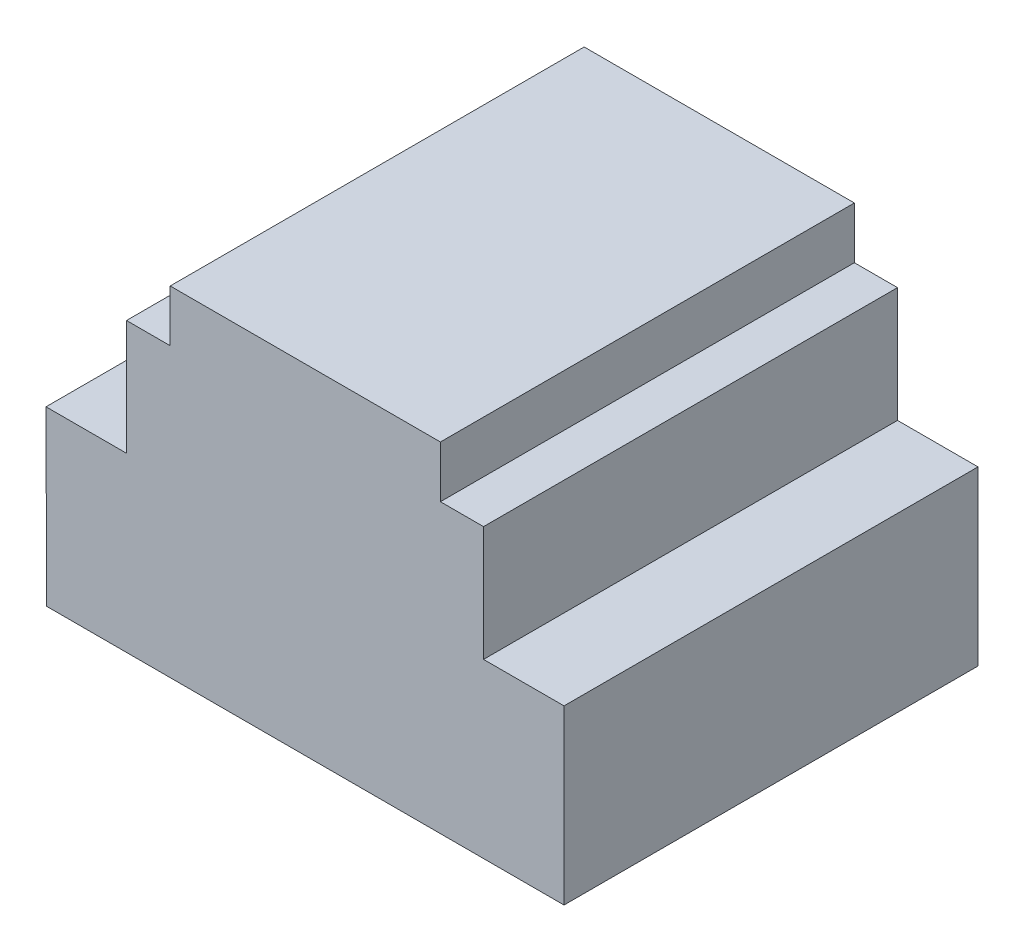
ISO-10303-21;
HEADER;
FILE_DESCRIPTION(('STEP AP214'),'2;1');
FILE_NAME('part.step','',(''),(''),'','','');
FILE_SCHEMA(('AUTOMOTIVE_DESIGN { 1 0 10303 214 1 1 1 1 }'));
ENDSEC;
DATA;
#1=APPLICATION_CONTEXT('core data for automotive mechanical design processes');
#2=APPLICATION_PROTOCOL_DEFINITION('international standard','automotive_design',2000,#1);
#3=PRODUCT_CONTEXT('',#1,'mechanical');
#4=PRODUCT('Part','Part','',(#3));
#5=PRODUCT_RELATED_PRODUCT_CATEGORY('part','',(#4));
#6=PRODUCT_DEFINITION_FORMATION('','',#4);
#7=PRODUCT_DEFINITION_CONTEXT('part definition',#1,'design');
#8=PRODUCT_DEFINITION('design','',#6,#7);
#9=PRODUCT_DEFINITION_SHAPE('','',#8);
#10=(LENGTH_UNIT() NAMED_UNIT(*) SI_UNIT(.MILLI.,.METRE.));
#11=(NAMED_UNIT(*) PLANE_ANGLE_UNIT() SI_UNIT($,.RADIAN.));
#12=(NAMED_UNIT(*) SI_UNIT($,.STERADIAN.) SOLID_ANGLE_UNIT());
#13=UNCERTAINTY_MEASURE_WITH_UNIT(LENGTH_MEASURE(1.E-05),#10,'distance_accuracy_value','');
#14=(GEOMETRIC_REPRESENTATION_CONTEXT(3) GLOBAL_UNCERTAINTY_ASSIGNED_CONTEXT((#13)) GLOBAL_UNIT_ASSIGNED_CONTEXT((#10,
#11,#12)) REPRESENTATION_CONTEXT('',''));
#15=CARTESIAN_POINT('',(0.,0.,0.));
#16=DIRECTION('',(0.,0.,1.));
#17=DIRECTION('',(1.,0.,0.));
#18=AXIS2_PLACEMENT_3D('',#15,#16,#17);
#19=CARTESIAN_POINT('',(-0.0999999999999908,30.,72.));
#20=DIRECTION('',(0.99999444449074,0.00333331481496883,0.));
#21=DIRECTION('',(-0.00333331481496883,0.99999444449074,0.));
#22=AXIS2_PLACEMENT_3D('',#19,#20,#21);
#23=PLANE('',#22);
#24=DIRECTION('',(0.00333331481496883,-0.99999444449074,0.));
#25=VECTOR('',#24,1.);
#26=CARTESIAN_POINT('',(-0.0999999999999908,30.,0.));
#27=LINE('',#26,#25);
#28=CARTESIAN_POINT('',(-0.0999999999999908,30.,0.));
#29=VERTEX_POINT('',#28);
#30=CARTESIAN_POINT('',(0.,0.,0.));
#31=VERTEX_POINT('',#30);
#32=EDGE_CURVE('E156',#29,#31,#27,.T.);
#33=ORIENTED_EDGE('',*,*,#32,.T.);
#34=DIRECTION('',(0.,0.,-1.));
#35=VECTOR('',#34,1.);
#36=CARTESIAN_POINT('',(0.,0.,72.));
#37=LINE('',#36,#35);
#38=CARTESIAN_POINT('',(0.,0.,72.));
#39=VERTEX_POINT('',#38);
#40=EDGE_CURVE('E11',#39,#31,#37,.T.);
#41=ORIENTED_EDGE('',*,*,#40,.F.);
#42=DIRECTION('',(0.00333331481496883,-0.99999444449074,0.));
#43=VECTOR('',#42,1.);
#44=CARTESIAN_POINT('',(-0.0999999999999908,30.,72.));
#45=LINE('',#44,#43);
#46=CARTESIAN_POINT('',(-0.0999999999999908,30.,72.));
#47=VERTEX_POINT('',#46);
#48=EDGE_CURVE('E178',#47,#39,#45,.T.);
#49=ORIENTED_EDGE('',*,*,#48,.F.);
#50=DIRECTION('',(0.,0.,-1.));
#51=VECTOR('',#50,1.);
#52=CARTESIAN_POINT('',(-0.0999999999999908,30.,72.));
#53=LINE('',#52,#51);
#54=EDGE_CURVE('E152',#47,#29,#53,.T.);
#55=ORIENTED_EDGE('',*,*,#54,.T.);
#56=EDGE_LOOP('',(#33,#41,#49,#55));
#57=FACE_BOUND('',#56,.T.);
#58=ADVANCED_FACE('F36',(#57),#23,.F.);
#59=CARTESIAN_POINT('',(0.,0.,72.));
#60=DIRECTION('',(0.,1.,0.));
#61=DIRECTION('',(0.,0.,1.));
#62=AXIS2_PLACEMENT_3D('',#59,#60,#61);
#63=PLANE('',#62);
#64=DIRECTION('',(1.,0.,0.));
#65=VECTOR('',#64,1.);
#66=CARTESIAN_POINT('',(0.,0.,0.));
#67=LINE('',#66,#65);
#68=CARTESIAN_POINT('',(90.,0.,0.));
#69=VERTEX_POINT('',#68);
#70=EDGE_CURVE('E159',#31,#69,#67,.T.);
#71=ORIENTED_EDGE('',*,*,#70,.T.);
#72=DIRECTION('',(0.,0.,-1.));
#73=VECTOR('',#72,1.);
#74=CARTESIAN_POINT('',(90.,0.,72.));
#75=LINE('',#74,#73);
#76=CARTESIAN_POINT('',(90.,0.,72.));
#77=VERTEX_POINT('',#76);
#78=EDGE_CURVE('E44',#77,#69,#75,.T.);
#79=ORIENTED_EDGE('',*,*,#78,.F.);
#80=DIRECTION('',(1.,0.,0.));
#81=VECTOR('',#80,1.);
#82=CARTESIAN_POINT('',(0.,0.,72.));
#83=LINE('',#82,#81);
#84=EDGE_CURVE('E107',#39,#77,#83,.T.);
#85=ORIENTED_EDGE('',*,*,#84,.F.);
#86=ORIENTED_EDGE('',*,*,#40,.T.);
#87=EDGE_LOOP('',(#71,#79,#85,#86));
#88=FACE_BOUND('',#87,.T.);
#89=ADVANCED_FACE('F256',(#88),#63,.F.);
#90=CARTESIAN_POINT('',(90.,0.,72.));
#91=DIRECTION('',(-1.,0.,0.));
#92=DIRECTION('',(0.,0.,1.));
#93=AXIS2_PLACEMENT_3D('',#90,#91,#92);
#94=PLANE('',#93);
#95=DIRECTION('',(0.,1.,0.));
#96=VECTOR('',#95,1.);
#97=CARTESIAN_POINT('',(90.,0.,0.));
#98=LINE('',#97,#96);
#99=CARTESIAN_POINT('',(90.,30.,0.));
#100=VERTEX_POINT('',#99);
#101=EDGE_CURVE('E161',#69,#100,#98,.T.);
#102=ORIENTED_EDGE('',*,*,#101,.T.);
#103=DIRECTION('',(0.,0.,-1.));
#104=VECTOR('',#103,1.);
#105=CARTESIAN_POINT('',(90.,30.,72.));
#106=LINE('',#105,#104);
#107=CARTESIAN_POINT('',(90.,30.,72.));
#108=VERTEX_POINT('',#107);
#109=EDGE_CURVE('E197',#108,#100,#106,.T.);
#110=ORIENTED_EDGE('',*,*,#109,.F.);
#111=DIRECTION('',(0.,1.,0.));
#112=VECTOR('',#111,1.);
#113=CARTESIAN_POINT('',(90.,0.,72.));
#114=LINE('',#113,#112);
#115=EDGE_CURVE('E205',#77,#108,#114,.T.);
#116=ORIENTED_EDGE('',*,*,#115,.F.);
#117=ORIENTED_EDGE('',*,*,#78,.T.);
#118=EDGE_LOOP('',(#102,#110,#116,#117));
#119=FACE_BOUND('',#118,.T.);
#120=ADVANCED_FACE('F203',(#119),#94,.F.);
#121=CARTESIAN_POINT('',(90.,30.,72.));
#122=DIRECTION('',(0.,-1.,0.));
#123=DIRECTION('',(0.,0.,-1.));
#124=AXIS2_PLACEMENT_3D('',#121,#122,#123);
#125=PLANE('',#124);
#126=DIRECTION('',(-1.,0.,0.));
#127=VECTOR('',#126,1.);
#128=CARTESIAN_POINT('',(90.,30.,0.));
#129=LINE('',#128,#127);
#130=CARTESIAN_POINT('',(76.,30.,0.));
#131=VERTEX_POINT('',#130);
#132=EDGE_CURVE('E163',#100,#131,#129,.T.);
#133=ORIENTED_EDGE('',*,*,#132,.T.);
#134=DIRECTION('',(0.,0.,-1.));
#135=VECTOR('',#134,1.);
#136=CARTESIAN_POINT('',(76.,30.,72.));
#137=LINE('',#136,#135);
#138=CARTESIAN_POINT('',(76.,30.,72.));
#139=VERTEX_POINT('',#138);
#140=EDGE_CURVE('E194',#139,#131,#137,.T.);
#141=ORIENTED_EDGE('',*,*,#140,.F.);
#142=DIRECTION('',(-1.,0.,0.));
#143=VECTOR('',#142,1.);
#144=CARTESIAN_POINT('',(90.,30.,72.));
#145=LINE('',#144,#143);
#146=EDGE_CURVE('E223',#108,#139,#145,.T.);
#147=ORIENTED_EDGE('',*,*,#146,.F.);
#148=ORIENTED_EDGE('',*,*,#109,.T.);
#149=EDGE_LOOP('',(#133,#141,#147,#148));
#150=FACE_BOUND('',#149,.T.);
#151=ADVANCED_FACE('F214',(#150),#125,.F.);
#152=CARTESIAN_POINT('',(76.,30.,72.));
#153=DIRECTION('',(-1.,0.,0.));
#154=DIRECTION('',(0.,0.,1.));
#155=AXIS2_PLACEMENT_3D('',#152,#153,#154);
#156=PLANE('',#155);
#157=DIRECTION('',(0.,1.,0.));
#158=VECTOR('',#157,1.);
#159=CARTESIAN_POINT('',(76.,30.,0.));
#160=LINE('',#159,#158);
#161=CARTESIAN_POINT('',(76.,50.,0.));
#162=VERTEX_POINT('',#161);
#163=EDGE_CURVE('E165',#131,#162,#160,.T.);
#164=ORIENTED_EDGE('',*,*,#163,.T.);
#165=DIRECTION('',(0.,0.,-1.));
#166=VECTOR('',#165,1.);
#167=CARTESIAN_POINT('',(76.,50.,72.));
#168=LINE('',#167,#166);
#169=CARTESIAN_POINT('',(76.,50.,72.));
#170=VERTEX_POINT('',#169);
#171=EDGE_CURVE('E191',#170,#162,#168,.T.);
#172=ORIENTED_EDGE('',*,*,#171,.F.);
#173=DIRECTION('',(0.,1.,0.));
#174=VECTOR('',#173,1.);
#175=CARTESIAN_POINT('',(76.,30.,72.));
#176=LINE('',#175,#174);
#177=EDGE_CURVE('E220',#139,#170,#176,.T.);
#178=ORIENTED_EDGE('',*,*,#177,.F.);
#179=ORIENTED_EDGE('',*,*,#140,.T.);
#180=EDGE_LOOP('',(#164,#172,#178,#179));
#181=FACE_BOUND('',#180,.T.);
#182=ADVANCED_FACE('F218',(#181),#156,.F.);
#183=CARTESIAN_POINT('',(76.,50.,72.));
#184=DIRECTION('',(0.,-1.,0.));
#185=DIRECTION('',(0.,0.,-1.));
#186=AXIS2_PLACEMENT_3D('',#183,#184,#185);
#187=PLANE('',#186);
#188=DIRECTION('',(-1.,0.,0.));
#189=VECTOR('',#188,1.);
#190=CARTESIAN_POINT('',(76.,50.,0.));
#191=LINE('',#190,#189);
#192=CARTESIAN_POINT('',(68.5,50.,0.));
#193=VERTEX_POINT('',#192);
#194=EDGE_CURVE('E167',#162,#193,#191,.T.);
#195=ORIENTED_EDGE('',*,*,#194,.T.);
#196=DIRECTION('',(0.,0.,-1.));
#197=VECTOR('',#196,1.);
#198=CARTESIAN_POINT('',(68.5,50.,72.));
#199=LINE('',#198,#197);
#200=CARTESIAN_POINT('',(68.5,50.,72.));
#201=VERTEX_POINT('',#200);
#202=EDGE_CURVE('E188',#201,#193,#199,.T.);
#203=ORIENTED_EDGE('',*,*,#202,.F.);
#204=DIRECTION('',(-1.,0.,0.));
#205=VECTOR('',#204,1.);
#206=CARTESIAN_POINT('',(76.,50.,72.));
#207=LINE('',#206,#205);
#208=EDGE_CURVE('E222',#170,#201,#207,.T.);
#209=ORIENTED_EDGE('',*,*,#208,.F.);
#210=ORIENTED_EDGE('',*,*,#171,.T.);
#211=EDGE_LOOP('',(#195,#203,#209,#210));
#212=FACE_BOUND('',#211,.T.);
#213=ADVANCED_FACE('F269',(#212),#187,.F.);
#214=CARTESIAN_POINT('',(68.5,50.,72.));
#215=DIRECTION('',(-1.,0.,0.));
#216=DIRECTION('',(0.,0.,1.));
#217=AXIS2_PLACEMENT_3D('',#214,#215,#216);
#218=PLANE('',#217);
#219=DIRECTION('',(0.,1.,0.));
#220=VECTOR('',#219,1.);
#221=CARTESIAN_POINT('',(68.5,50.,0.));
#222=LINE('',#221,#220);
#223=CARTESIAN_POINT('',(68.5,59.,0.));
#224=VERTEX_POINT('',#223);
#225=EDGE_CURVE('E169',#193,#224,#222,.T.);
#226=ORIENTED_EDGE('',*,*,#225,.T.);
#227=DIRECTION('',(0.,0.,-1.));
#228=VECTOR('',#227,1.);
#229=CARTESIAN_POINT('',(68.5,59.,72.));
#230=LINE('',#229,#228);
#231=CARTESIAN_POINT('',(68.5,59.,72.));
#232=VERTEX_POINT('',#231);
#233=EDGE_CURVE('E185',#232,#224,#230,.T.);
#234=ORIENTED_EDGE('',*,*,#233,.F.);
#235=DIRECTION('',(0.,1.,0.));
#236=VECTOR('',#235,1.);
#237=CARTESIAN_POINT('',(68.5,50.,72.));
#238=LINE('',#237,#236);
#239=EDGE_CURVE('E225',#201,#232,#238,.T.);
#240=ORIENTED_EDGE('',*,*,#239,.F.);
#241=ORIENTED_EDGE('',*,*,#202,.T.);
#242=EDGE_LOOP('',(#226,#234,#240,#241));
#243=FACE_BOUND('',#242,.T.);
#244=ADVANCED_FACE('F272',(#243),#218,.F.);
#245=CARTESIAN_POINT('',(68.5,59.,72.));
#246=DIRECTION('',(0.,-1.,0.));
#247=DIRECTION('',(1.,0.,0.));
#248=AXIS2_PLACEMENT_3D('',#245,#246,#247);
#249=PLANE('',#248);
#250=DIRECTION('',(-1.,0.,0.));
#251=VECTOR('',#250,1.);
#252=CARTESIAN_POINT('',(68.5,59.,0.));
#253=LINE('',#252,#251);
#254=CARTESIAN_POINT('',(21.5,59.,0.));
#255=VERTEX_POINT('',#254);
#256=EDGE_CURVE('E171',#224,#255,#253,.T.);
#257=ORIENTED_EDGE('',*,*,#256,.T.);
#258=DIRECTION('',(0.,0.,-1.));
#259=VECTOR('',#258,1.);
#260=CARTESIAN_POINT('',(21.5,59.,72.));
#261=LINE('',#260,#259);
#262=CARTESIAN_POINT('',(21.5,59.,72.));
#263=VERTEX_POINT('',#262);
#264=EDGE_CURVE('E182',#263,#255,#261,.T.);
#265=ORIENTED_EDGE('',*,*,#264,.F.);
#266=DIRECTION('',(-1.,0.,0.));
#267=VECTOR('',#266,1.);
#268=CARTESIAN_POINT('',(68.5,59.,72.));
#269=LINE('',#268,#267);
#270=EDGE_CURVE('E231',#232,#263,#269,.T.);
#271=ORIENTED_EDGE('',*,*,#270,.F.);
#272=ORIENTED_EDGE('',*,*,#233,.T.);
#273=EDGE_LOOP('',(#257,#265,#271,#272));
#274=FACE_BOUND('',#273,.T.);
#275=ADVANCED_FACE('F237',(#274),#249,.F.);
#276=CARTESIAN_POINT('',(21.5,59.,72.));
#277=DIRECTION('',(1.,0.,0.));
#278=DIRECTION('',(0.,0.,-1.));
#279=AXIS2_PLACEMENT_3D('',#276,#277,#278);
#280=PLANE('',#279);
#281=DIRECTION('',(0.,-1.,0.));
#282=VECTOR('',#281,1.);
#283=CARTESIAN_POINT('',(21.5,59.,0.));
#284=LINE('',#283,#282);
#285=CARTESIAN_POINT('',(21.5,50.,0.));
#286=VERTEX_POINT('',#285);
#287=EDGE_CURVE('E173',#255,#286,#284,.T.);
#288=ORIENTED_EDGE('',*,*,#287,.T.);
#289=DIRECTION('',(0.,0.,-1.));
#290=VECTOR('',#289,1.);
#291=CARTESIAN_POINT('',(21.5,50.,72.));
#292=LINE('',#291,#290);
#293=CARTESIAN_POINT('',(21.5,50.,72.));
#294=VERTEX_POINT('',#293);
#295=EDGE_CURVE('E147',#294,#286,#292,.T.);
#296=ORIENTED_EDGE('',*,*,#295,.F.);
#297=DIRECTION('',(0.,-1.,0.));
#298=VECTOR('',#297,1.);
#299=CARTESIAN_POINT('',(21.5,59.,72.));
#300=LINE('',#299,#298);
#301=EDGE_CURVE('E138',#263,#294,#300,.T.);
#302=ORIENTED_EDGE('',*,*,#301,.F.);
#303=ORIENTED_EDGE('',*,*,#264,.T.);
#304=EDGE_LOOP('',(#288,#296,#302,#303));
#305=FACE_BOUND('',#304,.T.);
#306=ADVANCED_FACE('F241',(#305),#280,.F.);
#307=CARTESIAN_POINT('',(21.5,50.,72.));
#308=DIRECTION('',(0.,-1.,0.));
#309=DIRECTION('',(0.,0.,-1.));
#310=AXIS2_PLACEMENT_3D('',#307,#308,#309);
#311=PLANE('',#310);
#312=DIRECTION('',(-1.,0.,0.));
#313=VECTOR('',#312,1.);
#314=CARTESIAN_POINT('',(21.5,50.,0.));
#315=LINE('',#314,#313);
#316=CARTESIAN_POINT('',(13.9,50.,0.));
#317=VERTEX_POINT('',#316);
#318=EDGE_CURVE('E146',#286,#317,#315,.T.);
#319=ORIENTED_EDGE('',*,*,#318,.T.);
#320=DIRECTION('',(0.,0.,-1.));
#321=VECTOR('',#320,1.);
#322=CARTESIAN_POINT('',(13.9,50.,72.));
#323=LINE('',#322,#321);
#324=CARTESIAN_POINT('',(13.9,50.,72.));
#325=VERTEX_POINT('',#324);
#326=EDGE_CURVE('E143',#325,#317,#323,.T.);
#327=ORIENTED_EDGE('',*,*,#326,.F.);
#328=DIRECTION('',(-1.,0.,0.));
#329=VECTOR('',#328,1.);
#330=CARTESIAN_POINT('',(21.5,50.,72.));
#331=LINE('',#330,#329);
#332=EDGE_CURVE('E132',#294,#325,#331,.T.);
#333=ORIENTED_EDGE('',*,*,#332,.F.);
#334=ORIENTED_EDGE('',*,*,#295,.T.);
#335=EDGE_LOOP('',(#319,#327,#333,#334));
#336=FACE_BOUND('',#335,.T.);
#337=ADVANCED_FACE('F144',(#336),#311,.F.);
#338=CARTESIAN_POINT('',(13.9,50.,72.));
#339=DIRECTION('',(1.,0.,0.));
#340=DIRECTION('',(0.,1.,0.));
#341=AXIS2_PLACEMENT_3D('',#338,#339,#340);
#342=PLANE('',#341);
#343=DIRECTION('',(0.,-1.,0.));
#344=VECTOR('',#343,1.);
#345=CARTESIAN_POINT('',(13.9,50.,0.));
#346=LINE('',#345,#344);
#347=CARTESIAN_POINT('',(13.9,30.,0.));
#348=VERTEX_POINT('',#347);
#349=EDGE_CURVE('E93',#317,#348,#346,.T.);
#350=ORIENTED_EDGE('',*,*,#349,.T.);
#351=DIRECTION('',(0.,0.,-1.));
#352=VECTOR('',#351,1.);
#353=CARTESIAN_POINT('',(13.9,30.,72.));
#354=LINE('',#353,#352);
#355=CARTESIAN_POINT('',(13.9,30.,72.));
#356=VERTEX_POINT('',#355);
#357=EDGE_CURVE('E148',#356,#348,#354,.T.);
#358=ORIENTED_EDGE('',*,*,#357,.F.);
#359=DIRECTION('',(0.,-1.,0.));
#360=VECTOR('',#359,1.);
#361=CARTESIAN_POINT('',(13.9,50.,72.));
#362=LINE('',#361,#360);
#363=EDGE_CURVE('E136',#325,#356,#362,.T.);
#364=ORIENTED_EDGE('',*,*,#363,.F.);
#365=ORIENTED_EDGE('',*,*,#326,.T.);
#366=EDGE_LOOP('',(#350,#358,#364,#365));
#367=FACE_BOUND('',#366,.T.);
#368=ADVANCED_FACE('F150',(#367),#342,.F.);
#369=CARTESIAN_POINT('',(13.9,30.,72.));
#370=DIRECTION('',(0.,-1.,0.));
#371=DIRECTION('',(1.,0.,0.));
#372=AXIS2_PLACEMENT_3D('',#369,#370,#371);
#373=PLANE('',#372);
#374=DIRECTION('',(-1.,0.,0.));
#375=VECTOR('',#374,1.);
#376=CARTESIAN_POINT('',(13.9,30.,0.));
#377=LINE('',#376,#375);
#378=EDGE_CURVE('E99',#348,#29,#377,.T.);
#379=ORIENTED_EDGE('',*,*,#378,.T.);
#380=ORIENTED_EDGE('',*,*,#54,.F.);
#381=DIRECTION('',(-1.,0.,0.));
#382=VECTOR('',#381,1.);
#383=CARTESIAN_POINT('',(13.9,30.,72.));
#384=LINE('',#383,#382);
#385=EDGE_CURVE('E52',#356,#47,#384,.T.);
#386=ORIENTED_EDGE('',*,*,#385,.F.);
#387=ORIENTED_EDGE('',*,*,#357,.T.);
#388=EDGE_LOOP('',(#379,#380,#386,#387));
#389=FACE_BOUND('',#388,.T.);
#390=ADVANCED_FACE('F245',(#389),#373,.F.);
#391=CARTESIAN_POINT('',(0.,0.,72.));
#392=DIRECTION('',(0.,0.,1.));
#393=DIRECTION('',(1.,0.,0.));
#394=AXIS2_PLACEMENT_3D('',#391,#392,#393);
#395=PLANE('',#394);
#396=ORIENTED_EDGE('',*,*,#48,.T.);
#397=ORIENTED_EDGE('',*,*,#84,.T.);
#398=ORIENTED_EDGE('',*,*,#115,.T.);
#399=ORIENTED_EDGE('',*,*,#146,.T.);
#400=ORIENTED_EDGE('',*,*,#177,.T.);
#401=ORIENTED_EDGE('',*,*,#208,.T.);
#402=ORIENTED_EDGE('',*,*,#239,.T.);
#403=ORIENTED_EDGE('',*,*,#270,.T.);
#404=ORIENTED_EDGE('',*,*,#301,.T.);
#405=ORIENTED_EDGE('',*,*,#332,.T.);
#406=ORIENTED_EDGE('',*,*,#363,.T.);
#407=ORIENTED_EDGE('',*,*,#385,.T.);
#408=EDGE_LOOP('',(#396,#397,#398,#399,#400,#401,#402,#403,#404,#405,#406,#407));
#409=FACE_BOUND('',#408,.T.);
#410=ADVANCED_FACE('F134',(#409),#395,.T.);
#411=CARTESIAN_POINT('',(0.,0.,0.));
#412=DIRECTION('',(0.,0.,1.));
#413=DIRECTION('',(1.,0.,0.));
#414=AXIS2_PLACEMENT_3D('',#411,#412,#413);
#415=PLANE('',#414);
#416=ORIENTED_EDGE('',*,*,#32,.F.);
#417=ORIENTED_EDGE('',*,*,#378,.F.);
#418=ORIENTED_EDGE('',*,*,#349,.F.);
#419=ORIENTED_EDGE('',*,*,#318,.F.);
#420=ORIENTED_EDGE('',*,*,#287,.F.);
#421=ORIENTED_EDGE('',*,*,#256,.F.);
#422=ORIENTED_EDGE('',*,*,#225,.F.);
#423=ORIENTED_EDGE('',*,*,#194,.F.);
#424=ORIENTED_EDGE('',*,*,#163,.F.);
#425=ORIENTED_EDGE('',*,*,#132,.F.);
#426=ORIENTED_EDGE('',*,*,#101,.F.);
#427=ORIENTED_EDGE('',*,*,#70,.F.);
#428=EDGE_LOOP('',(#416,#417,#418,#419,#420,#421,#422,#423,#424,#425,#426,#427));
#429=FACE_BOUND('',#428,.T.);
#430=ADVANCED_FACE('F209',(#429),#415,.F.);
#431=CLOSED_SHELL('',(#58,#89,#120,#151,#182,#213,#244,#275,#306,#337,#368,#390,#410,#430));
#432=MANIFOLD_SOLID_BREP('B2',#431);
#433=ADVANCED_BREP_SHAPE_REPRESENTATION('',(#18,#432),#14);
#434=SHAPE_DEFINITION_REPRESENTATION(#9,#433);
ENDSEC;
END-ISO-10303-21;
